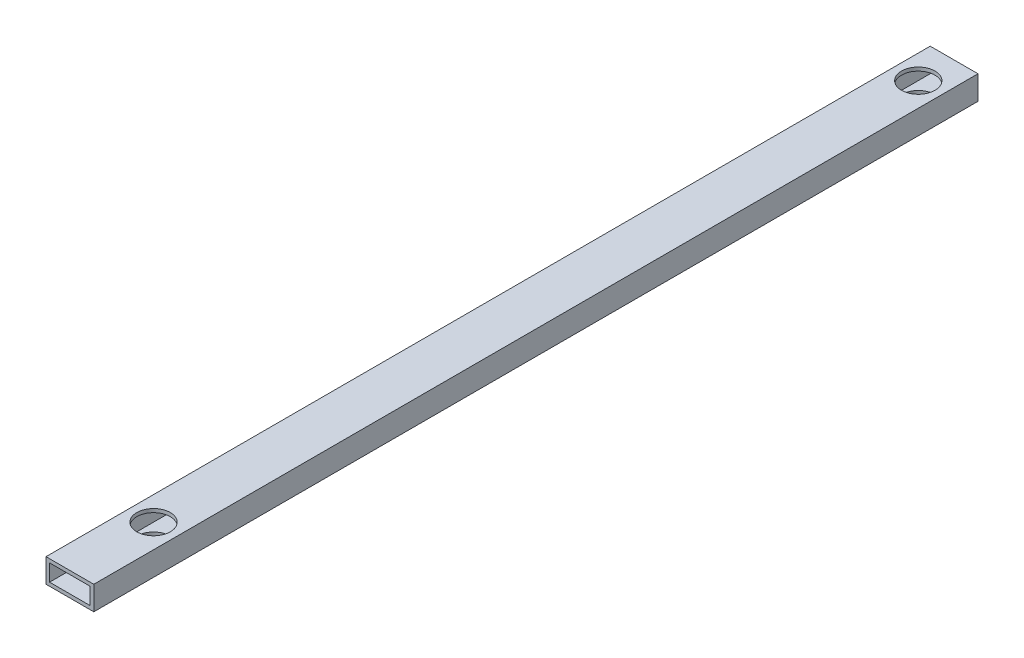
ISO-10303-21;
HEADER;
FILE_DESCRIPTION(('STEP AP214'),'2;1');
FILE_NAME('part.step','',(''),(''),'','','');
FILE_SCHEMA(('AUTOMOTIVE_DESIGN { 1 0 10303 214 1 1 1 1 }'));
ENDSEC;
DATA;
#1=APPLICATION_CONTEXT('core data for automotive mechanical design processes');
#2=APPLICATION_PROTOCOL_DEFINITION('international standard','automotive_design',2000,#1);
#3=PRODUCT_CONTEXT('',#1,'mechanical');
#4=PRODUCT('Part','Part','',(#3));
#5=PRODUCT_RELATED_PRODUCT_CATEGORY('part','',(#4));
#6=PRODUCT_DEFINITION_FORMATION('','',#4);
#7=PRODUCT_DEFINITION_CONTEXT('part definition',#1,'design');
#8=PRODUCT_DEFINITION('design','',#6,#7);
#9=PRODUCT_DEFINITION_SHAPE('','',#8);
#10=(LENGTH_UNIT() NAMED_UNIT(*) SI_UNIT(.MILLI.,.METRE.));
#11=(NAMED_UNIT(*) PLANE_ANGLE_UNIT() SI_UNIT($,.RADIAN.));
#12=(NAMED_UNIT(*) SI_UNIT($,.STERADIAN.) SOLID_ANGLE_UNIT());
#13=UNCERTAINTY_MEASURE_WITH_UNIT(LENGTH_MEASURE(1.E-05),#10,'distance_accuracy_value','');
#14=(GEOMETRIC_REPRESENTATION_CONTEXT(3) GLOBAL_UNCERTAINTY_ASSIGNED_CONTEXT((#13)) GLOBAL_UNIT_ASSIGNED_CONTEXT((#10,
#11,#12)) REPRESENTATION_CONTEXT('',''));
#15=CARTESIAN_POINT('',(0.,0.,0.));
#16=DIRECTION('',(0.,0.,1.));
#17=DIRECTION('',(1.,0.,0.));
#18=AXIS2_PLACEMENT_3D('',#15,#16,#17);
#19=CARTESIAN_POINT('',(0.,0.,370.));
#20=DIRECTION('',(0.,0.,1.));
#21=DIRECTION('',(1.,0.,0.));
#22=AXIS2_PLACEMENT_3D('',#19,#20,#21);
#23=PLANE('',#22);
#24=DIRECTION('',(0.,1.,0.));
#25=VECTOR('',#24,1.);
#26=CARTESIAN_POINT('',(10.,5.,370.));
#27=LINE('',#26,#25);
#28=CARTESIAN_POINT('',(10.,-5.,370.));
#29=VERTEX_POINT('',#28);
#30=CARTESIAN_POINT('',(10.,5.,370.));
#31=VERTEX_POINT('',#30);
#32=EDGE_CURVE('E143',#29,#31,#27,.T.);
#33=ORIENTED_EDGE('',*,*,#32,.T.);
#34=DIRECTION('',(-1.,0.,0.));
#35=VECTOR('',#34,1.);
#36=CARTESIAN_POINT('',(-10.,5.,370.));
#37=LINE('',#36,#35);
#38=CARTESIAN_POINT('',(-10.,5.,370.));
#39=VERTEX_POINT('',#38);
#40=EDGE_CURVE('E146',#31,#39,#37,.T.);
#41=ORIENTED_EDGE('',*,*,#40,.T.);
#42=DIRECTION('',(0.,-1.,0.));
#43=VECTOR('',#42,1.);
#44=CARTESIAN_POINT('',(-10.,5.,370.));
#45=LINE('',#44,#43);
#46=CARTESIAN_POINT('',(-10.,-5.,370.));
#47=VERTEX_POINT('',#46);
#48=EDGE_CURVE('E150',#39,#47,#45,.T.);
#49=ORIENTED_EDGE('',*,*,#48,.T.);
#50=DIRECTION('',(1.,0.,0.));
#51=VECTOR('',#50,1.);
#52=CARTESIAN_POINT('',(-10.,-5.,370.));
#53=LINE('',#52,#51);
#54=EDGE_CURVE('E255',#47,#29,#53,.T.);
#55=ORIENTED_EDGE('',*,*,#54,.T.);
#56=EDGE_LOOP('',(#33,#41,#49,#55));
#57=FACE_BOUND('',#56,.T.);
#58=DIRECTION('',(-1.,0.,0.));
#59=VECTOR('',#58,1.);
#60=CARTESIAN_POINT('',(-8.5,3.5,370.));
#61=LINE('',#60,#59);
#62=CARTESIAN_POINT('',(8.5,3.5,370.));
#63=VERTEX_POINT('',#62);
#64=CARTESIAN_POINT('',(-8.5,3.5,370.));
#65=VERTEX_POINT('',#64);
#66=EDGE_CURVE('E113',#63,#65,#61,.T.);
#67=ORIENTED_EDGE('',*,*,#66,.F.);
#68=DIRECTION('',(0.,1.,0.));
#69=VECTOR('',#68,1.);
#70=CARTESIAN_POINT('',(8.5,3.5,370.));
#71=LINE('',#70,#69);
#72=CARTESIAN_POINT('',(8.5,-3.5,370.));
#73=VERTEX_POINT('',#72);
#74=EDGE_CURVE('E105',#73,#63,#71,.T.);
#75=ORIENTED_EDGE('',*,*,#74,.F.);
#76=DIRECTION('',(1.,0.,0.));
#77=VECTOR('',#76,1.);
#78=CARTESIAN_POINT('',(-8.5,-3.5,370.));
#79=LINE('',#78,#77);
#80=CARTESIAN_POINT('',(-8.5,-3.5,370.));
#81=VERTEX_POINT('',#80);
#82=EDGE_CURVE('E127',#81,#73,#79,.T.);
#83=ORIENTED_EDGE('',*,*,#82,.F.);
#84=DIRECTION('',(0.,-1.,0.));
#85=VECTOR('',#84,1.);
#86=CARTESIAN_POINT('',(-8.5,3.5,370.));
#87=LINE('',#86,#85);
#88=EDGE_CURVE('E125',#65,#81,#87,.T.);
#89=ORIENTED_EDGE('',*,*,#88,.F.);
#90=EDGE_LOOP('',(#67,#75,#83,#89));
#91=FACE_BOUND('',#90,.T.);
#92=ADVANCED_FACE('F39',(#57,#91),#23,.T.);
#93=CARTESIAN_POINT('',(0.,0.,0.));
#94=DIRECTION('',(0.,0.,1.));
#95=DIRECTION('',(1.,0.,0.));
#96=AXIS2_PLACEMENT_3D('',#93,#94,#95);
#97=PLANE('',#96);
#98=DIRECTION('',(0.,1.,0.));
#99=VECTOR('',#98,1.);
#100=CARTESIAN_POINT('',(10.,5.,0.));
#101=LINE('',#100,#99);
#102=CARTESIAN_POINT('',(10.,-5.,0.));
#103=VERTEX_POINT('',#102);
#104=CARTESIAN_POINT('',(10.,5.,0.));
#105=VERTEX_POINT('',#104);
#106=EDGE_CURVE('E121',#103,#105,#101,.T.);
#107=ORIENTED_EDGE('',*,*,#106,.F.);
#108=DIRECTION('',(1.,0.,0.));
#109=VECTOR('',#108,1.);
#110=CARTESIAN_POINT('',(-10.,-5.,0.));
#111=LINE('',#110,#109);
#112=CARTESIAN_POINT('',(-10.,-5.,0.));
#113=VERTEX_POINT('',#112);
#114=EDGE_CURVE('E147',#113,#103,#111,.T.);
#115=ORIENTED_EDGE('',*,*,#114,.F.);
#116=DIRECTION('',(0.,-1.,0.));
#117=VECTOR('',#116,1.);
#118=CARTESIAN_POINT('',(-10.,5.,0.));
#119=LINE('',#118,#117);
#120=CARTESIAN_POINT('',(-10.,5.,0.));
#121=VERTEX_POINT('',#120);
#122=EDGE_CURVE('E244',#121,#113,#119,.T.);
#123=ORIENTED_EDGE('',*,*,#122,.F.);
#124=DIRECTION('',(-1.,0.,0.));
#125=VECTOR('',#124,1.);
#126=CARTESIAN_POINT('',(-10.,5.,0.));
#127=LINE('',#126,#125);
#128=EDGE_CURVE('E238',#105,#121,#127,.T.);
#129=ORIENTED_EDGE('',*,*,#128,.F.);
#130=EDGE_LOOP('',(#107,#115,#123,#129));
#131=FACE_BOUND('',#130,.T.);
#132=DIRECTION('',(0.,1.,0.));
#133=VECTOR('',#132,1.);
#134=CARTESIAN_POINT('',(8.5,3.5,0.));
#135=LINE('',#134,#133);
#136=CARTESIAN_POINT('',(8.5,-3.5,0.));
#137=VERTEX_POINT('',#136);
#138=CARTESIAN_POINT('',(8.5,3.5,0.));
#139=VERTEX_POINT('',#138);
#140=EDGE_CURVE('E63',#137,#139,#135,.T.);
#141=ORIENTED_EDGE('',*,*,#140,.T.);
#142=DIRECTION('',(-1.,0.,0.));
#143=VECTOR('',#142,1.);
#144=CARTESIAN_POINT('',(-8.5,3.5,0.));
#145=LINE('',#144,#143);
#146=CARTESIAN_POINT('',(-8.5,3.5,0.));
#147=VERTEX_POINT('',#146);
#148=EDGE_CURVE('E120',#139,#147,#145,.T.);
#149=ORIENTED_EDGE('',*,*,#148,.T.);
#150=DIRECTION('',(0.,-1.,0.));
#151=VECTOR('',#150,1.);
#152=CARTESIAN_POINT('',(-8.5,3.5,0.));
#153=LINE('',#152,#151);
#154=CARTESIAN_POINT('',(-8.5,-3.5,0.));
#155=VERTEX_POINT('',#154);
#156=EDGE_CURVE('E135',#147,#155,#153,.T.);
#157=ORIENTED_EDGE('',*,*,#156,.T.);
#158=DIRECTION('',(1.,0.,0.));
#159=VECTOR('',#158,1.);
#160=CARTESIAN_POINT('',(-8.5,-3.5,0.));
#161=LINE('',#160,#159);
#162=EDGE_CURVE('E114',#155,#137,#161,.T.);
#163=ORIENTED_EDGE('',*,*,#162,.T.);
#164=EDGE_LOOP('',(#141,#149,#157,#163));
#165=FACE_BOUND('',#164,.T.);
#166=ADVANCED_FACE('F211',(#131,#165),#97,.F.);
#167=CARTESIAN_POINT('',(10.,5.,370.));
#168=DIRECTION('',(-1.,0.,0.));
#169=DIRECTION('',(0.,0.,1.));
#170=AXIS2_PLACEMENT_3D('',#167,#168,#169);
#171=PLANE('',#170);
#172=ORIENTED_EDGE('',*,*,#106,.T.);
#173=DIRECTION('',(0.,0.,-1.));
#174=VECTOR('',#173,1.);
#175=CARTESIAN_POINT('',(10.,5.,370.));
#176=LINE('',#175,#174);
#177=EDGE_CURVE('E12',#31,#105,#176,.T.);
#178=ORIENTED_EDGE('',*,*,#177,.F.);
#179=ORIENTED_EDGE('',*,*,#32,.F.);
#180=DIRECTION('',(0.,0.,-1.));
#181=VECTOR('',#180,1.);
#182=CARTESIAN_POINT('',(10.,-5.,370.));
#183=LINE('',#182,#181);
#184=EDGE_CURVE('E253',#29,#103,#183,.T.);
#185=ORIENTED_EDGE('',*,*,#184,.T.);
#186=EDGE_LOOP('',(#172,#178,#179,#185));
#187=FACE_BOUND('',#186,.T.);
#188=ADVANCED_FACE('F41',(#187),#171,.F.);
#189=CARTESIAN_POINT('',(-10.,5.,370.));
#190=DIRECTION('',(0.,-1.,0.));
#191=DIRECTION('',(0.,0.,-1.));
#192=AXIS2_PLACEMENT_3D('',#189,#190,#191);
#193=PLANE('',#192);
#194=CARTESIAN_POINT('',(0.,5.,15.));
#195=DIRECTION('',(0.,1.,0.));
#196=DIRECTION('',(0.,0.,1.));
#197=AXIS2_PLACEMENT_3D('',#194,#195,#196);
#198=CIRCLE('',#197,7.);
#199=CARTESIAN_POINT('',(0.,5.,22.));
#200=VERTEX_POINT('',#199);
#201=EDGE_CURVE('E166',#200,#200,#198,.T.);
#202=ORIENTED_EDGE('',*,*,#201,.F.);
#203=EDGE_LOOP('',(#202));
#204=FACE_BOUND('',#203,.T.);
#205=CARTESIAN_POINT('',(0.,5.,335.));
#206=DIRECTION('',(0.,1.,0.));
#207=DIRECTION('',(0.,0.,1.));
#208=AXIS2_PLACEMENT_3D('',#205,#206,#207);
#209=CIRCLE('',#208,7.);
#210=CARTESIAN_POINT('',(0.,5.,342.));
#211=VERTEX_POINT('',#210);
#212=EDGE_CURVE('E173',#211,#211,#209,.T.);
#213=ORIENTED_EDGE('',*,*,#212,.F.);
#214=EDGE_LOOP('',(#213));
#215=FACE_BOUND('',#214,.T.);
#216=ORIENTED_EDGE('',*,*,#128,.T.);
#217=DIRECTION('',(0.,0.,-1.));
#218=VECTOR('',#217,1.);
#219=CARTESIAN_POINT('',(-10.,5.,370.));
#220=LINE('',#219,#218);
#221=EDGE_CURVE('E48',#39,#121,#220,.T.);
#222=ORIENTED_EDGE('',*,*,#221,.F.);
#223=ORIENTED_EDGE('',*,*,#40,.F.);
#224=ORIENTED_EDGE('',*,*,#177,.T.);
#225=EDGE_LOOP('',(#216,#222,#223,#224));
#226=FACE_BOUND('',#225,.T.);
#227=ADVANCED_FACE('F226',(#204,#215,#226),#193,.F.);
#228=CARTESIAN_POINT('',(-10.,5.,370.));
#229=DIRECTION('',(1.,0.,0.));
#230=DIRECTION('',(0.,1.,0.));
#231=AXIS2_PLACEMENT_3D('',#228,#229,#230);
#232=PLANE('',#231);
#233=ORIENTED_EDGE('',*,*,#122,.T.);
#234=DIRECTION('',(0.,0.,-1.));
#235=VECTOR('',#234,1.);
#236=CARTESIAN_POINT('',(-10.,-5.,370.));
#237=LINE('',#236,#235);
#238=EDGE_CURVE('E160',#47,#113,#237,.T.);
#239=ORIENTED_EDGE('',*,*,#238,.F.);
#240=ORIENTED_EDGE('',*,*,#48,.F.);
#241=ORIENTED_EDGE('',*,*,#221,.T.);
#242=EDGE_LOOP('',(#233,#239,#240,#241));
#243=FACE_BOUND('',#242,.T.);
#244=ADVANCED_FACE('F224',(#243),#232,.F.);
#245=CARTESIAN_POINT('',(-10.,-5.,370.));
#246=DIRECTION('',(0.,1.,0.));
#247=DIRECTION('',(0.,0.,1.));
#248=AXIS2_PLACEMENT_3D('',#245,#246,#247);
#249=PLANE('',#248);
#250=CARTESIAN_POINT('',(0.,-5.,15.));
#251=DIRECTION('',(0.,1.,0.));
#252=DIRECTION('',(0.,0.,1.));
#253=AXIS2_PLACEMENT_3D('',#250,#251,#252);
#254=CIRCLE('',#253,7.);
#255=CARTESIAN_POINT('',(0.,-5.,22.));
#256=VERTEX_POINT('',#255);
#257=EDGE_CURVE('E133',#256,#256,#254,.T.);
#258=ORIENTED_EDGE('',*,*,#257,.T.);
#259=EDGE_LOOP('',(#258));
#260=FACE_BOUND('',#259,.T.);
#261=CARTESIAN_POINT('',(0.,-5.,335.));
#262=DIRECTION('',(0.,1.,0.));
#263=DIRECTION('',(0.,0.,1.));
#264=AXIS2_PLACEMENT_3D('',#261,#262,#263);
#265=CIRCLE('',#264,7.);
#266=CARTESIAN_POINT('',(0.,-5.,342.));
#267=VERTEX_POINT('',#266);
#268=EDGE_CURVE('E170',#267,#267,#265,.T.);
#269=ORIENTED_EDGE('',*,*,#268,.T.);
#270=EDGE_LOOP('',(#269));
#271=FACE_BOUND('',#270,.T.);
#272=ORIENTED_EDGE('',*,*,#114,.T.);
#273=ORIENTED_EDGE('',*,*,#184,.F.);
#274=ORIENTED_EDGE('',*,*,#54,.F.);
#275=ORIENTED_EDGE('',*,*,#238,.T.);
#276=EDGE_LOOP('',(#272,#273,#274,#275));
#277=FACE_BOUND('',#276,.T.);
#278=ADVANCED_FACE('F190',(#260,#271,#277),#249,.F.);
#279=CARTESIAN_POINT('',(8.5,3.5,370.));
#280=DIRECTION('',(-1.,0.,0.));
#281=DIRECTION('',(0.,0.,1.));
#282=AXIS2_PLACEMENT_3D('',#279,#280,#281);
#283=PLANE('',#282);
#284=ORIENTED_EDGE('',*,*,#140,.F.);
#285=DIRECTION('',(0.,0.,-1.));
#286=VECTOR('',#285,1.);
#287=CARTESIAN_POINT('',(8.5,-3.5,370.));
#288=LINE('',#287,#286);
#289=EDGE_CURVE('E109',#73,#137,#288,.T.);
#290=ORIENTED_EDGE('',*,*,#289,.F.);
#291=ORIENTED_EDGE('',*,*,#74,.T.);
#292=DIRECTION('',(0.,0.,-1.));
#293=VECTOR('',#292,1.);
#294=CARTESIAN_POINT('',(8.5,3.5,370.));
#295=LINE('',#294,#293);
#296=EDGE_CURVE('E108',#63,#139,#295,.T.);
#297=ORIENTED_EDGE('',*,*,#296,.T.);
#298=EDGE_LOOP('',(#284,#290,#291,#297));
#299=FACE_BOUND('',#298,.T.);
#300=ADVANCED_FACE('F107',(#299),#283,.T.);
#301=CARTESIAN_POINT('',(-8.5,3.5,370.));
#302=DIRECTION('',(0.,-1.,0.));
#303=DIRECTION('',(0.,0.,-1.));
#304=AXIS2_PLACEMENT_3D('',#301,#302,#303);
#305=PLANE('',#304);
#306=CARTESIAN_POINT('',(0.,3.5,15.));
#307=DIRECTION('',(0.,-1.,0.));
#308=DIRECTION('',(0.,0.,-1.));
#309=AXIS2_PLACEMENT_3D('',#306,#307,#308);
#310=CIRCLE('',#309,7.);
#311=CARTESIAN_POINT('',(0.,3.5,8.));
#312=VERTEX_POINT('',#311);
#313=EDGE_CURVE('E185',#312,#312,#310,.T.);
#314=ORIENTED_EDGE('',*,*,#313,.F.);
#315=EDGE_LOOP('',(#314));
#316=FACE_BOUND('',#315,.T.);
#317=CARTESIAN_POINT('',(0.,3.5,335.));
#318=DIRECTION('',(0.,-1.,0.));
#319=DIRECTION('',(0.,0.,-1.));
#320=AXIS2_PLACEMENT_3D('',#317,#318,#319);
#321=CIRCLE('',#320,7.);
#322=CARTESIAN_POINT('',(0.,3.5,328.));
#323=VERTEX_POINT('',#322);
#324=EDGE_CURVE('E165',#323,#323,#321,.T.);
#325=ORIENTED_EDGE('',*,*,#324,.F.);
#326=EDGE_LOOP('',(#325));
#327=FACE_BOUND('',#326,.T.);
#328=ORIENTED_EDGE('',*,*,#148,.F.);
#329=ORIENTED_EDGE('',*,*,#296,.F.);
#330=ORIENTED_EDGE('',*,*,#66,.T.);
#331=DIRECTION('',(0.,0.,-1.));
#332=VECTOR('',#331,1.);
#333=CARTESIAN_POINT('',(-8.5,3.5,370.));
#334=LINE('',#333,#332);
#335=EDGE_CURVE('E122',#65,#147,#334,.T.);
#336=ORIENTED_EDGE('',*,*,#335,.T.);
#337=EDGE_LOOP('',(#328,#329,#330,#336));
#338=FACE_BOUND('',#337,.T.);
#339=ADVANCED_FACE('F117',(#316,#327,#338),#305,.T.);
#340=CARTESIAN_POINT('',(-8.5,3.5,370.));
#341=DIRECTION('',(1.,0.,0.));
#342=DIRECTION('',(0.,0.,-1.));
#343=AXIS2_PLACEMENT_3D('',#340,#341,#342);
#344=PLANE('',#343);
#345=ORIENTED_EDGE('',*,*,#156,.F.);
#346=ORIENTED_EDGE('',*,*,#335,.F.);
#347=ORIENTED_EDGE('',*,*,#88,.T.);
#348=DIRECTION('',(0.,0.,-1.));
#349=VECTOR('',#348,1.);
#350=CARTESIAN_POINT('',(-8.5,-3.5,370.));
#351=LINE('',#350,#349);
#352=EDGE_CURVE('E55',#81,#155,#351,.T.);
#353=ORIENTED_EDGE('',*,*,#352,.T.);
#354=EDGE_LOOP('',(#345,#346,#347,#353));
#355=FACE_BOUND('',#354,.T.);
#356=ADVANCED_FACE('F262',(#355),#344,.T.);
#357=CARTESIAN_POINT('',(-8.5,-3.5,370.));
#358=DIRECTION('',(0.,1.,0.));
#359=DIRECTION('',(0.,0.,1.));
#360=AXIS2_PLACEMENT_3D('',#357,#358,#359);
#361=PLANE('',#360);
#362=CARTESIAN_POINT('',(0.,-3.5,15.));
#363=DIRECTION('',(0.,1.,0.));
#364=DIRECTION('',(0.,0.,1.));
#365=AXIS2_PLACEMENT_3D('',#362,#363,#364);
#366=CIRCLE('',#365,7.);
#367=CARTESIAN_POINT('',(0.,-3.5,22.));
#368=VERTEX_POINT('',#367);
#369=EDGE_CURVE('E43',#368,#368,#366,.T.);
#370=ORIENTED_EDGE('',*,*,#369,.F.);
#371=EDGE_LOOP('',(#370));
#372=FACE_BOUND('',#371,.T.);
#373=CARTESIAN_POINT('',(0.,-3.5,335.));
#374=DIRECTION('',(0.,1.,0.));
#375=DIRECTION('',(0.,0.,1.));
#376=AXIS2_PLACEMENT_3D('',#373,#374,#375);
#377=CIRCLE('',#376,7.);
#378=CARTESIAN_POINT('',(0.,-3.5,342.));
#379=VERTEX_POINT('',#378);
#380=EDGE_CURVE('E163',#379,#379,#377,.T.);
#381=ORIENTED_EDGE('',*,*,#380,.F.);
#382=EDGE_LOOP('',(#381));
#383=FACE_BOUND('',#382,.T.);
#384=ORIENTED_EDGE('',*,*,#162,.F.);
#385=ORIENTED_EDGE('',*,*,#352,.F.);
#386=ORIENTED_EDGE('',*,*,#82,.T.);
#387=ORIENTED_EDGE('',*,*,#289,.T.);
#388=EDGE_LOOP('',(#384,#385,#386,#387));
#389=FACE_BOUND('',#388,.T.);
#390=ADVANCED_FACE('F206',(#372,#383,#389),#361,.T.);
#391=CARTESIAN_POINT('',(0.,-275.,335.));
#392=DIRECTION('',(0.,1.,0.));
#393=DIRECTION('',(0.,0.,1.));
#394=AXIS2_PLACEMENT_3D('',#391,#392,#393);
#395=CYLINDRICAL_SURFACE('',#394,7.);
#396=ORIENTED_EDGE('',*,*,#380,.T.);
#397=EDGE_LOOP('',(#396));
#398=FACE_BOUND('',#397,.T.);
#399=ORIENTED_EDGE('',*,*,#268,.F.);
#400=EDGE_LOOP('',(#399));
#401=FACE_BOUND('',#400,.T.);
#402=ADVANCED_FACE('F196',(#398,#401),#395,.F.);
#403=CARTESIAN_POINT('',(0.,-275.,15.));
#404=DIRECTION('',(0.,1.,0.));
#405=DIRECTION('',(0.,0.,1.));
#406=AXIS2_PLACEMENT_3D('',#403,#404,#405);
#407=CYLINDRICAL_SURFACE('',#406,7.);
#408=ORIENTED_EDGE('',*,*,#369,.T.);
#409=EDGE_LOOP('',(#408));
#410=FACE_BOUND('',#409,.T.);
#411=ORIENTED_EDGE('',*,*,#257,.F.);
#412=EDGE_LOOP('',(#411));
#413=FACE_BOUND('',#412,.T.);
#414=ADVANCED_FACE('F193',(#410,#413),#407,.F.);
#415=ORIENTED_EDGE('',*,*,#324,.T.);
#416=EDGE_LOOP('',(#415));
#417=FACE_BOUND('',#416,.T.);
#418=ORIENTED_EDGE('',*,*,#212,.T.);
#419=EDGE_LOOP('',(#418));
#420=FACE_BOUND('',#419,.T.);
#421=ADVANCED_FACE('F195',(#417,#420),#395,.F.);
#422=ORIENTED_EDGE('',*,*,#313,.T.);
#423=EDGE_LOOP('',(#422));
#424=FACE_BOUND('',#423,.T.);
#425=ORIENTED_EDGE('',*,*,#201,.T.);
#426=EDGE_LOOP('',(#425));
#427=FACE_BOUND('',#426,.T.);
#428=ADVANCED_FACE('F199',(#424,#427),#407,.F.);
#429=CLOSED_SHELL('',(#92,#166,#188,#227,#244,#278,#300,#339,#356,#390,#402,#414,#421,#428));
#430=MANIFOLD_SOLID_BREP('B2',#429);
#431=ADVANCED_BREP_SHAPE_REPRESENTATION('',(#18,#430),#14);
#432=SHAPE_DEFINITION_REPRESENTATION(#9,#431);
ENDSEC;
END-ISO-10303-21;
